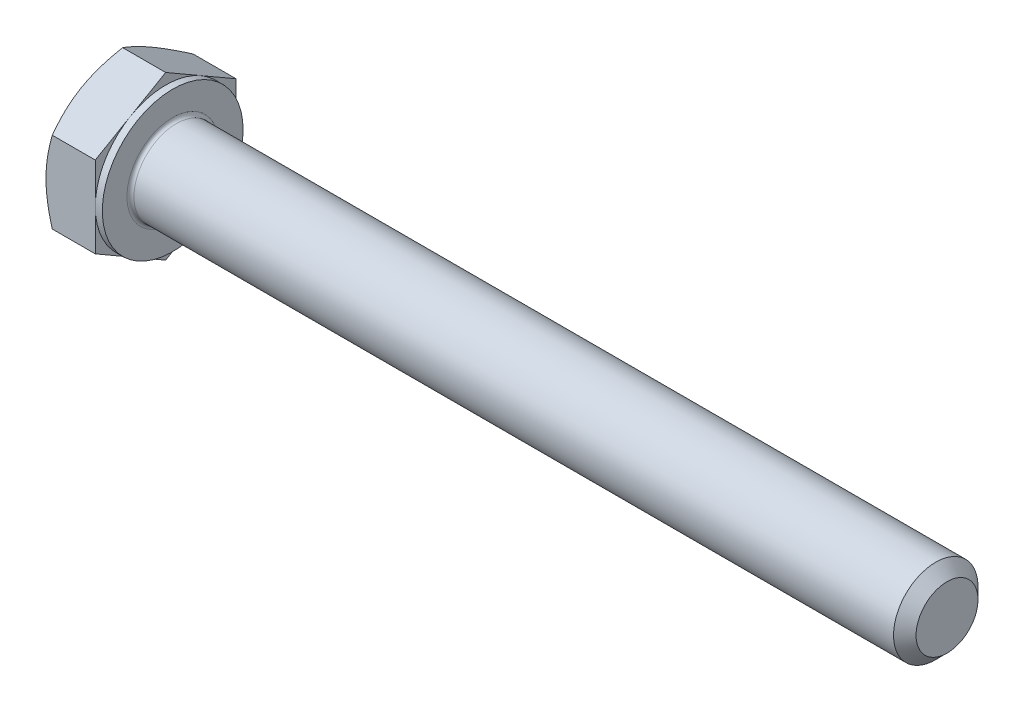
ISO-10303-21;
HEADER;
FILE_DESCRIPTION(('STEP AP214'),'2;1');
FILE_NAME('part.step','',(''),(''),'','','');
FILE_SCHEMA(('AUTOMOTIVE_DESIGN { 1 0 10303 214 1 1 1 1 }'));
ENDSEC;
DATA;
#1=APPLICATION_CONTEXT('core data for automotive mechanical design processes');
#2=APPLICATION_PROTOCOL_DEFINITION('international standard','automotive_design',2000,#1);
#3=PRODUCT_CONTEXT('',#1,'mechanical');
#4=PRODUCT('Part','Part','',(#3));
#5=PRODUCT_RELATED_PRODUCT_CATEGORY('part','',(#4));
#6=PRODUCT_DEFINITION_FORMATION('','',#4);
#7=PRODUCT_DEFINITION_CONTEXT('part definition',#1,'design');
#8=PRODUCT_DEFINITION('design','',#6,#7);
#9=PRODUCT_DEFINITION_SHAPE('','',#8);
#10=(LENGTH_UNIT() NAMED_UNIT(*) SI_UNIT(.MILLI.,.METRE.));
#11=(NAMED_UNIT(*) PLANE_ANGLE_UNIT() SI_UNIT($,.RADIAN.));
#12=(NAMED_UNIT(*) SI_UNIT($,.STERADIAN.) SOLID_ANGLE_UNIT());
#13=UNCERTAINTY_MEASURE_WITH_UNIT(LENGTH_MEASURE(1.E-05),#10,'distance_accuracy_value','');
#14=(GEOMETRIC_REPRESENTATION_CONTEXT(3) GLOBAL_UNCERTAINTY_ASSIGNED_CONTEXT((#13)) GLOBAL_UNIT_ASSIGNED_CONTEXT((#10,
#11,#12)) REPRESENTATION_CONTEXT('',''));
#15=CARTESIAN_POINT('',(0.,0.,0.));
#16=DIRECTION('',(0.,0.,1.));
#17=DIRECTION('',(1.,0.,0.));
#18=AXIS2_PLACEMENT_3D('',#15,#16,#17);
#19=CARTESIAN_POINT('',(4.,2.88675134594813,-5.));
#20=DIRECTION('',(0.,-0.866025403784438,0.500000000000001));
#21=DIRECTION('',(0.,-0.500000000000001,-0.866025403784438));
#22=AXIS2_PLACEMENT_3D('',#19,#20,#21);
#23=PLANE('',#22);
#24=DIRECTION('',(0.,0.500000000000001,0.866025403784438));
#25=VECTOR('',#24,1.);
#26=CARTESIAN_POINT('',(3.5,2.88675134594813,-5.));
#27=LINE('',#26,#25);
#28=CARTESIAN_POINT('',(3.5,2.88675134594813,-5.));
#29=VERTEX_POINT('',#28);
#30=CARTESIAN_POINT('',(3.5,4.33012701892219,-2.5));
#31=VERTEX_POINT('',#30);
#32=EDGE_CURVE('E174',#29,#31,#27,.T.);
#33=ORIENTED_EDGE('',*,*,#32,.F.);
#34=DIRECTION('',(-1.,0.,0.));
#35=VECTOR('',#34,1.);
#36=CARTESIAN_POINT('',(4.,2.88675134594813,-5.));
#37=LINE('',#36,#35);
#38=CARTESIAN_POINT('',(0.446581987385201,2.88675134594813,-5.));
#39=VERTEX_POINT('',#38);
#40=EDGE_CURVE('E302',#29,#39,#37,.T.);
#41=ORIENTED_EDGE('',*,*,#40,.T.);
#42=CARTESIAN_POINT('',(0.44664865605183,5.7736181619501,0.0002));
#43=CARTESIAN_POINT('',(0.373386567637636,5.64675433465071,-0.219534594525185));
#44=CARTESIAN_POINT('',(0.306751321918093,5.5188054379059,-0.441148584459581));
#45=CARTESIAN_POINT('',(0.190438991010812,5.26069210252318,-0.888213995453514));
#46=CARTESIAN_POINT('',(0.14080304991579,5.13052307794721,-1.11367335959077));
#47=CARTESIAN_POINT('',(0.0635510254186987,4.87177839004641,-1.56183230522351));
#48=CARTESIAN_POINT('',(0.0354203782834902,4.74324302208387,-1.78446209310419));
#49=CARTESIAN_POINT('',(0.0101949219536852,4.54998783160116,-2.11918990184664));
#50=CARTESIAN_POINT('',(0.00461345976948451,4.48552534905128,-2.23084219680506));
#51=CARTESIAN_POINT('',(-0.000797783248529426,4.35654081066911,-2.4542499706738));
#52=CARTESIAN_POINT('',(-0.000627741741796329,4.2920187567385,-2.56600544629031));
#53=CARTESIAN_POINT('',(0.00775363179203665,4.11524635305244,-2.87218423085064));
#54=CARTESIAN_POINT('',(0.0218297718972515,4.00305457769146,-3.06650608596721));
#55=CARTESIAN_POINT('',(0.0664652571094307,3.77941563226457,-3.45386010199771));
#56=CARTESIAN_POINT('',(0.0970398601475079,3.66796924828418,-3.64689090137157));
#57=CARTESIAN_POINT('',(0.173468493621163,3.44387972423144,-4.03502534247485));
#58=CARTESIAN_POINT('',(0.219646378878679,3.3312648659868,-4.23007999864174));
#59=CARTESIAN_POINT('',(0.324451794491933,3.1077146415794,-4.61728034535877));
#60=CARTESIAN_POINT('',(0.383054703437373,2.99677641204847,-4.80943099540809));
#61=CARTESIAN_POINT('',(0.446648656051827,2.88663587589429,-5.0002));
#62=B_SPLINE_CURVE_WITH_KNOTS('',3,(#42,#43,#44,#45,#46,#47,#48,#49,#50,#51,#52,#53,#54,#55,#56,
#57,#58,#59,#60,#61),.UNSPECIFIED.,.F.,.F.,(4,2,2,2,2,2,2,2,2,4),(0.,0.792555841363091,
1.58701660053334,2.36181537487281,2.74884076077325,3.13585419177295,3.80962362599679,
4.48401723901189,5.17336882348929,5.86136694793725),.UNSPECIFIED.);
#63=CARTESIAN_POINT('',(0.,4.33012701892219,-2.5));
#64=VERTEX_POINT('',#63);
#65=EDGE_CURVE('E229',#64,#39,#62,.T.);
#66=ORIENTED_EDGE('',*,*,#65,.F.);
#67=CARTESIAN_POINT('',(0.446581987385204,5.77350269189626,0.));
#68=VERTEX_POINT('',#67);
#69=EDGE_CURVE('E65',#68,#64,#62,.T.);
#70=ORIENTED_EDGE('',*,*,#69,.F.);
#71=DIRECTION('',(-1.,0.,0.));
#72=VECTOR('',#71,1.);
#73=CARTESIAN_POINT('',(4.,5.77350269189626,0.));
#74=LINE('',#73,#72);
#75=CARTESIAN_POINT('',(3.5,5.77350269189626,0.));
#76=VERTEX_POINT('',#75);
#77=EDGE_CURVE('E294',#76,#68,#74,.T.);
#78=ORIENTED_EDGE('',*,*,#77,.F.);
#79=EDGE_CURVE('E172',#31,#76,#27,.T.);
#80=ORIENTED_EDGE('',*,*,#79,.F.);
#81=EDGE_LOOP('',(#33,#41,#66,#70,#78,#80));
#82=FACE_BOUND('',#81,.T.);
#83=ADVANCED_FACE('F42',(#82),#23,.F.);
#84=CARTESIAN_POINT('',(4.,5.77350269189626,0.));
#85=DIRECTION('',(0.,-0.866025403784438,-0.500000000000001));
#86=DIRECTION('',(0.,0.500000000000001,-0.866025403784438));
#87=AXIS2_PLACEMENT_3D('',#84,#85,#86);
#88=PLANE('',#87);
#89=DIRECTION('',(0.,-0.500000000000001,0.866025403784438));
#90=VECTOR('',#89,1.);
#91=CARTESIAN_POINT('',(3.5,5.77350269189626,0.));
#92=LINE('',#91,#90);
#93=CARTESIAN_POINT('',(3.5,4.33012701892219,2.5));
#94=VERTEX_POINT('',#93);
#95=EDGE_CURVE('E171',#76,#94,#92,.T.);
#96=ORIENTED_EDGE('',*,*,#95,.F.);
#97=ORIENTED_EDGE('',*,*,#77,.T.);
#98=CARTESIAN_POINT('',(0.446648656051827,2.88663587589429,5.0002));
#99=CARTESIAN_POINT('',(0.373386567637633,3.01349970319368,4.78046540547481));
#100=CARTESIAN_POINT('',(0.30675132191809,3.14144859993849,4.55885141554042));
#101=CARTESIAN_POINT('',(0.19043899101081,3.39956193532121,4.11178600454649));
#102=CARTESIAN_POINT('',(0.140803049915788,3.52973095989717,3.88632664040923));
#103=CARTESIAN_POINT('',(0.0635510254186973,3.78847564779797,3.43816769477649));
#104=CARTESIAN_POINT('',(0.0354203782834888,3.91701101576052,3.21553790689581));
#105=CARTESIAN_POINT('',(0.0101949219536842,4.11026620624322,2.88081009815336));
#106=CARTESIAN_POINT('',(0.00461345976948371,4.17472868879311,2.76915780319494));
#107=CARTESIAN_POINT('',(-0.000797783248529873,4.30371322717528,2.5457500293262));
#108=CARTESIAN_POINT('',(-0.000627741741796623,4.36823528110589,2.43399455370969));
#109=CARTESIAN_POINT('',(0.00775363179203684,4.54500768479194,2.12781576914936));
#110=CARTESIAN_POINT('',(0.0218297718972522,4.65719946015292,1.93349391403279));
#111=CARTESIAN_POINT('',(0.0664652571094319,4.88083840557981,1.5461398980023));
#112=CARTESIAN_POINT('',(0.0970398601475093,4.9922847895602,1.35310909862843));
#113=CARTESIAN_POINT('',(0.173468493621165,5.21637431361295,0.964974657525146));
#114=CARTESIAN_POINT('',(0.219646378878682,5.32898917185759,0.769920001358265));
#115=CARTESIAN_POINT('',(0.324451794491936,5.55253939626498,0.382719654641232));
#116=CARTESIAN_POINT('',(0.383054703437376,5.66347762579592,0.190569004591913));
#117=CARTESIAN_POINT('',(0.44664865605183,5.7736181619501,-0.000200000000000133));
#118=B_SPLINE_CURVE_WITH_KNOTS('',3,(#98,#99,#100,#101,#102,#103,#104,#105,#106,#107,#108,#109,
#110,#111,#112,#113,#114,#115,#116,#117),.UNSPECIFIED.,.F.,.F.,(4,2,2,2,2,2,2,2,2,4),(0.,
0.79255584136309,1.58701660053333,2.3618153748728,2.74884076077325,3.13585419177295,
3.80962362599679,4.48401723901189,5.17336882348929,5.86136694793726),.UNSPECIFIED.);
#119=CARTESIAN_POINT('',(0.,4.33012701892219,2.50000000000001));
#120=VERTEX_POINT('',#119);
#121=EDGE_CURVE('E226',#120,#68,#118,.T.);
#122=ORIENTED_EDGE('',*,*,#121,.F.);
#123=CARTESIAN_POINT('',(0.4465819873852,2.88675134594813,5.));
#124=VERTEX_POINT('',#123);
#125=EDGE_CURVE('E240',#124,#120,#118,.T.);
#126=ORIENTED_EDGE('',*,*,#125,.F.);
#127=DIRECTION('',(-1.,0.,0.));
#128=VECTOR('',#127,1.);
#129=CARTESIAN_POINT('',(4.,2.88675134594813,5.));
#130=LINE('',#129,#128);
#131=CARTESIAN_POINT('',(3.5,2.88675134594813,5.));
#132=VERTEX_POINT('',#131);
#133=EDGE_CURVE('E296',#132,#124,#130,.T.);
#134=ORIENTED_EDGE('',*,*,#133,.F.);
#135=EDGE_CURVE('E139',#94,#132,#92,.T.);
#136=ORIENTED_EDGE('',*,*,#135,.F.);
#137=EDGE_LOOP('',(#96,#97,#122,#126,#134,#136));
#138=FACE_BOUND('',#137,.T.);
#139=ADVANCED_FACE('F247',(#138),#88,.F.);
#140=CARTESIAN_POINT('',(4.,2.88675134594813,5.));
#141=DIRECTION('',(0.,0.,-1.));
#142=DIRECTION('',(-1.,0.,0.));
#143=AXIS2_PLACEMENT_3D('',#140,#141,#142);
#144=PLANE('',#143);
#145=DIRECTION('',(0.,-1.,0.));
#146=VECTOR('',#145,1.);
#147=CARTESIAN_POINT('',(3.5,2.88675134594813,5.));
#148=LINE('',#147,#146);
#149=CARTESIAN_POINT('',(3.5,0.,5.));
#150=VERTEX_POINT('',#149);
#151=EDGE_CURVE('E133',#132,#150,#148,.T.);
#152=ORIENTED_EDGE('',*,*,#151,.F.);
#153=ORIENTED_EDGE('',*,*,#133,.T.);
#154=CARTESIAN_POINT('',(2.47533544689296,-7.8266164031389,5.));
#155=CARTESIAN_POINT('',(2.36879683507773,-7.60758613024922,5.));
#156=CARTESIAN_POINT('',(2.26325911833056,-7.38806071364411,5.));
#157=CARTESIAN_POINT('',(2.05474707865951,-6.94775649535434,5.));
#158=CARTESIAN_POINT('',(1.95177314617003,-6.72697750897689,5.));
#159=CARTESIAN_POINT('',(1.74844778545275,-6.28280027125598,5.));
#160=CARTESIAN_POINT('',(1.64811306490869,-6.05939434592714,5.));
#161=CARTESIAN_POINT('',(1.45145486004312,-5.61083043832921,5.));
#162=CARTESIAN_POINT('',(1.35513119080617,-5.38567253739806,5.));
#163=CARTESIAN_POINT('',(1.16445037605961,-4.92576614780203,5.));
#164=CARTESIAN_POINT('',(1.07026351405996,-4.69094667859485,5.));
#165=CARTESIAN_POINT('',(0.88884438735084,-4.21858752735363,5.));
#166=CARTESIAN_POINT('',(0.801612892640662,-3.98104754746318,5.));
#167=CARTESIAN_POINT('',(0.636341071883241,-3.50329086404364,5.));
#168=CARTESIAN_POINT('',(0.558282765149712,-3.26308044250487,5.));
#169=CARTESIAN_POINT('',(0.413813856737666,-2.77921467819532,5.));
#170=CARTESIAN_POINT('',(0.347399663631976,-2.53556042276,5.));
#171=CARTESIAN_POINT('',(0.229707450535052,-2.04600448312504,5.));
#172=CARTESIAN_POINT('',(0.178346573442479,-1.80012308686184,5.));
#173=CARTESIAN_POINT('',(0.0936230804935155,-1.30522837494366,5.));
#174=CARTESIAN_POINT('',(0.0602585789244923,-1.05621539022478,5.));
#175=CARTESIAN_POINT('',(0.014622993380484,-0.559584253783073,5.));
#176=CARTESIAN_POINT('',(0.00207498506584076,-0.31199219296768,5.));
#177=CARTESIAN_POINT('',(-0.00159747165030538,0.183375584056734,5.));
#178=CARTESIAN_POINT('',(0.0072784944808621,0.431151303726636,5.));
#179=CARTESIAN_POINT('',(0.0397265053205833,0.849622860758222,5.));
#180=CARTESIAN_POINT('',(0.0579847912618783,1.02075746544156,5.));
#181=CARTESIAN_POINT('',(0.103624049996721,1.36181398757519,5.));
#182=CARTESIAN_POINT('',(0.131006199082923,1.5317357457727,5.));
#183=CARTESIAN_POINT('',(0.225403333816321,2.03942834541586,5.));
#184=CARTESIAN_POINT('',(0.304653621104035,2.37495177168563,5.));
#185=CARTESIAN_POINT('',(0.442611792168637,2.87686006020151,5.));
#186=CARTESIAN_POINT('',(0.492453035928114,3.04583048582564,5.));
#187=CARTESIAN_POINT('',(0.597441969480138,3.38213061038658,5.));
#188=CARTESIAN_POINT('',(0.652589698776802,3.54946029709869,5.));
#189=CARTESIAN_POINT('',(0.767295730006394,3.88253122341816,5.));
#190=CARTESIAN_POINT('',(0.826852713137812,4.04827292137364,5.));
#191=CARTESIAN_POINT('',(0.949663499110049,4.37837269604183,5.));
#192=CARTESIAN_POINT('',(1.01291722636637,4.54273080096525,5.));
#193=CARTESIAN_POINT('',(1.18384085306905,4.97467594039769,5.));
#194=CARTESIAN_POINT('',(1.29410564783453,5.24123504256648,5.));
#195=CARTESIAN_POINT('',(1.52085041203992,5.77170603526334,5.));
#196=CARTESIAN_POINT('',(1.63733099805396,6.03561766007928,5.));
#197=CARTESIAN_POINT('',(1.87507624393348,6.56138078778337,5.));
#198=CARTESIAN_POINT('',(1.99634255328238,6.82323154239329,5.));
#199=CARTESIAN_POINT('',(2.24254703861692,7.34518395602015,5.));
#200=CARTESIAN_POINT('',(2.36748508200602,7.60528567778374,5.));
#201=CARTESIAN_POINT('',(2.62044102887898,8.12446478659922,5.));
#202=CARTESIAN_POINT('',(2.74846325062126,8.38354006552433,5.));
#203=CARTESIAN_POINT('',(3.00682668967549,8.9005329112754,5.));
#204=CARTESIAN_POINT('',(3.13716793074432,9.15845046620729,5.));
#205=CARTESIAN_POINT('',(3.53092424591316,9.93067662274979,5.));
#206=CARTESIAN_POINT('',(3.79712405172275,10.4435647238032,5.));
#207=CARTESIAN_POINT('',(4.3072404688117,11.4147548711532,5.));
#208=CARTESIAN_POINT('',(4.55067498762245,11.873311348306,5.));
#209=CARTESIAN_POINT('',(5.04052915785298,12.7888590468283,5.));
#210=CARTESIAN_POINT('',(5.28694897482743,13.2458501795696,5.));
#211=CARTESIAN_POINT('',(5.7812250534644,14.1571829390174,5.));
#212=CARTESIAN_POINT('',(6.02907430461245,14.6115283739736,5.));
#213=CARTESIAN_POINT('',(6.5264818551985,15.5192398746589,5.));
#214=CARTESIAN_POINT('',(6.77604002809907,15.9726060096992,5.));
#215=CARTESIAN_POINT('',(7.02622264559118,16.4256251044156,5.));
#216=B_SPLINE_CURVE_WITH_KNOTS('',3,(#154,#155,#156,#157,#158,#159,#160,#161,#162,#163,#164,
#165,#166,#167,#168,#169,#170,#171,#172,#173,#174,#175,#176,#177,#178,#179,#180,#181,#182,#183,
#184,#185,#186,#187,#188,#189,#190,#191,#192,#193,#194,#195,#196,#197,#198,#199,#200,#201,#202,
#203,#204,#205,#206,#207,#208,#209,#210,#211,#212,#213,#214,#215),.UNSPECIFIED.,.F.,.F.,(4,2,2,
2,2,2,2,2,2,2,2,2,2,2,2,2,2,2,2,2,2,2,2,2,2,2,2,2,2,2,4),(0.,0.730708682143099,1.46152797033751,
2.19620403652928,2.930846195478,3.68977491658213,4.44878753915767,5.20628666210828,
5.9635517348485,6.71656679485872,7.46950293642268,8.212339912373,8.95519126159774,
9.47125991232469,9.98739512288342,11.0201893937443,11.5486465414698,12.0771076235976,
12.6054112774226,13.1337041332035,13.9989833719716,14.8643486020619,15.7300147459346,
16.5956496665091,17.4625765068272,18.3295122333794,20.0630293163822,21.6205191219182,
23.1780956996636,24.7307447704824,26.2832800921359),.UNSPECIFIED.);
#217=CARTESIAN_POINT('',(0.,0.,5.));
#218=VERTEX_POINT('',#217);
#219=EDGE_CURVE('E241',#218,#124,#216,.T.);
#220=ORIENTED_EDGE('',*,*,#219,.F.);
#221=CARTESIAN_POINT('',(0.446581987385202,-2.88675134594813,5.));
#222=VERTEX_POINT('',#221);
#223=EDGE_CURVE('E303',#222,#218,#216,.T.);
#224=ORIENTED_EDGE('',*,*,#223,.F.);
#225=DIRECTION('',(-1.,0.,0.));
#226=VECTOR('',#225,1.);
#227=CARTESIAN_POINT('',(4.,-2.88675134594813,5.));
#228=LINE('',#227,#226);
#229=CARTESIAN_POINT('',(3.5,-2.88675134594813,5.));
#230=VERTEX_POINT('',#229);
#231=EDGE_CURVE('E165',#230,#222,#228,.T.);
#232=ORIENTED_EDGE('',*,*,#231,.F.);
#233=EDGE_CURVE('E143',#150,#230,#148,.T.);
#234=ORIENTED_EDGE('',*,*,#233,.F.);
#235=EDGE_LOOP('',(#152,#153,#220,#224,#232,#234));
#236=FACE_BOUND('',#235,.T.);
#237=ADVANCED_FACE('F163',(#236),#144,.F.);
#238=CARTESIAN_POINT('',(4.,-5.77350269189627,0.));
#239=DIRECTION('',(0.,0.866025403784438,-0.500000000000001));
#240=DIRECTION('',(0.,0.500000000000001,0.866025403784438));
#241=AXIS2_PLACEMENT_3D('',#238,#239,#240);
#242=PLANE('',#241);
#243=DIRECTION('',(0.,-0.500000000000001,-0.866025403784438));
#244=VECTOR('',#243,1.);
#245=CARTESIAN_POINT('',(3.5,-5.77350269189627,0.));
#246=LINE('',#245,#244);
#247=CARTESIAN_POINT('',(3.5,-4.33012701892219,2.50000000000001));
#248=VERTEX_POINT('',#247);
#249=EDGE_CURVE('E150',#230,#248,#246,.T.);
#250=ORIENTED_EDGE('',*,*,#249,.F.);
#251=ORIENTED_EDGE('',*,*,#231,.T.);
#252=CARTESIAN_POINT('',(0.446648656051834,-5.77361816195011,-0.000200000000000089));
#253=CARTESIAN_POINT('',(0.37338656763764,-5.64675433465072,0.219534594525185));
#254=CARTESIAN_POINT('',(0.306751321918097,-5.51880543790591,0.441148584459581));
#255=CARTESIAN_POINT('',(0.190438991010815,-5.26069210252319,0.888213995453514));
#256=CARTESIAN_POINT('',(0.140803049915793,-5.13052307794722,1.11367335959078));
#257=CARTESIAN_POINT('',(0.0635510254187016,-4.87177839004642,1.56183230522351));
#258=CARTESIAN_POINT('',(0.0354203782834927,-4.74324302208387,1.78446209310419));
#259=CARTESIAN_POINT('',(0.0101949219536879,-4.54998783160117,2.11918990184664));
#260=CARTESIAN_POINT('',(0.00461345976948741,-4.48552534905128,2.23084219680506));
#261=CARTESIAN_POINT('',(-0.00079778324852632,-4.35654081066911,2.4542499706738));
#262=CARTESIAN_POINT('',(-0.000627741741793222,-4.2920187567385,2.56600544629032));
#263=CARTESIAN_POINT('',(0.00775363179203982,-4.11524635305245,2.87218423085064));
#264=CARTESIAN_POINT('',(0.0218297718972548,-4.00305457769146,3.06650608596722));
#265=CARTESIAN_POINT('',(0.0664652571094336,-3.77941563226458,3.45386010199771));
#266=CARTESIAN_POINT('',(0.0970398601475104,-3.66796924828419,3.64689090137157));
#267=CARTESIAN_POINT('',(0.173468493621165,-3.44387972423144,4.03502534247485));
#268=CARTESIAN_POINT('',(0.219646378878682,-3.3312648659868,4.23007999864174));
#269=CARTESIAN_POINT('',(0.324451794491935,-3.10771464157941,4.61728034535877));
#270=CARTESIAN_POINT('',(0.383054703437375,-2.99677641204847,4.80943099540809));
#271=CARTESIAN_POINT('',(0.446648656051828,-2.88663587589429,5.0002));
#272=B_SPLINE_CURVE_WITH_KNOTS('',3,(#252,#253,#254,#255,#256,#257,#258,#259,#260,#261,#262,
#263,#264,#265,#266,#267,#268,#269,#270,#271),.UNSPECIFIED.,.F.,.F.,(4,2,2,2,2,2,2,2,2,4),(0.,
0.792555841363092,1.58701660053334,2.36181537487281,2.74884076077326,3.13585419177295,
3.8096236259968,4.4840172390119,5.17336882348929,5.86136694793725),.UNSPECIFIED.);
#273=CARTESIAN_POINT('',(0.,-4.33012701892219,2.50000000000001));
#274=VERTEX_POINT('',#273);
#275=EDGE_CURVE('E228',#274,#222,#272,.T.);
#276=ORIENTED_EDGE('',*,*,#275,.F.);
#277=CARTESIAN_POINT('',(0.446581987385207,-5.77350269189627,0.));
#278=VERTEX_POINT('',#277);
#279=EDGE_CURVE('E220',#278,#274,#272,.T.);
#280=ORIENTED_EDGE('',*,*,#279,.F.);
#281=DIRECTION('',(-1.,0.,0.));
#282=VECTOR('',#281,1.);
#283=CARTESIAN_POINT('',(4.,-5.77350269189627,0.));
#284=LINE('',#283,#282);
#285=CARTESIAN_POINT('',(3.5,-5.77350269189627,0.));
#286=VERTEX_POINT('',#285);
#287=EDGE_CURVE('E299',#286,#278,#284,.T.);
#288=ORIENTED_EDGE('',*,*,#287,.F.);
#289=EDGE_CURVE('E166',#248,#286,#246,.T.);
#290=ORIENTED_EDGE('',*,*,#289,.F.);
#291=EDGE_LOOP('',(#250,#251,#276,#280,#288,#290));
#292=FACE_BOUND('',#291,.T.);
#293=ADVANCED_FACE('F211',(#292),#242,.F.);
#294=CARTESIAN_POINT('',(4.,-2.88675134594813,-5.));
#295=DIRECTION('',(0.,0.866025403784438,0.5));
#296=DIRECTION('',(0.,-0.5,0.866025403784438));
#297=AXIS2_PLACEMENT_3D('',#294,#295,#296);
#298=PLANE('',#297);
#299=DIRECTION('',(0.,0.5,-0.866025403784438));
#300=VECTOR('',#299,1.);
#301=CARTESIAN_POINT('',(3.5,-2.88675134594813,-5.));
#302=LINE('',#301,#300);
#303=CARTESIAN_POINT('',(3.5,-4.33012701892219,-2.5));
#304=VERTEX_POINT('',#303);
#305=EDGE_CURVE('E349',#286,#304,#302,.T.);
#306=ORIENTED_EDGE('',*,*,#305,.F.);
#307=ORIENTED_EDGE('',*,*,#287,.T.);
#308=CARTESIAN_POINT('',(0.44664865605183,-2.8866358758943,-5.0002));
#309=CARTESIAN_POINT('',(0.373386567637636,-3.01349970319369,-4.78046540547482));
#310=CARTESIAN_POINT('',(0.306751321918094,-3.1414485999385,-4.55885141554042));
#311=CARTESIAN_POINT('',(0.190438991010813,-3.39956193532121,-4.11178600454649));
#312=CARTESIAN_POINT('',(0.140803049915792,-3.52973095989718,-3.88632664040923));
#313=CARTESIAN_POINT('',(0.0635510254187009,-3.78847564779798,-3.43816769477649));
#314=CARTESIAN_POINT('',(0.0354203782834924,-3.91701101576052,-3.21553790689581));
#315=CARTESIAN_POINT('',(0.0101949219536882,-4.11026620624323,-2.88081009815336));
#316=CARTESIAN_POINT('',(0.00461345976948794,-4.17472868879311,-2.76915780319494));
#317=CARTESIAN_POINT('',(-0.000797783248525594,-4.30371322717528,-2.5457500293262));
#318=CARTESIAN_POINT('',(-0.000627741741792501,-4.3682352811059,-2.43399455370969));
#319=CARTESIAN_POINT('',(0.00775363179204097,-4.54500768479195,-2.12781576914936));
#320=CARTESIAN_POINT('',(0.0218297718972568,-4.65719946015293,-1.93349391403279));
#321=CARTESIAN_POINT('',(0.0664652571094364,-4.88083840557982,-1.54613989800229));
#322=CARTESIAN_POINT('',(0.0970398601475133,-4.99228478956021,-1.35310909862843));
#323=CARTESIAN_POINT('',(0.173468493621169,-5.21637431361296,-0.964974657525146));
#324=CARTESIAN_POINT('',(0.219646378878685,-5.3289891718576,-0.769920001358264));
#325=CARTESIAN_POINT('',(0.32445179449194,-5.55253939626499,-0.382719654641232));
#326=CARTESIAN_POINT('',(0.38305470343738,-5.66347762579593,-0.190569004591914));
#327=CARTESIAN_POINT('',(0.446648656051834,-5.77361816195011,0.0001999999999997));
#328=B_SPLINE_CURVE_WITH_KNOTS('',3,(#308,#309,#310,#311,#312,#313,#314,#315,#316,#317,#318,
#319,#320,#321,#322,#323,#324,#325,#326,#327),.UNSPECIFIED.,.F.,.F.,(4,2,2,2,2,2,2,2,2,4),(0.,
0.792555841363092,1.58701660053334,2.36181537487281,2.74884076077326,3.13585419177295,
3.80962362599679,4.48401723901189,5.17336882348929,5.86136694793725),.UNSPECIFIED.);
#329=CARTESIAN_POINT('',(0.,-4.33012701892219,-2.5));
#330=VERTEX_POINT('',#329);
#331=EDGE_CURVE('E227',#330,#278,#328,.T.);
#332=ORIENTED_EDGE('',*,*,#331,.F.);
#333=CARTESIAN_POINT('',(0.446581987384949,-2.88675134594852,-5.));
#334=VERTEX_POINT('',#333);
#335=EDGE_CURVE('E188',#334,#330,#328,.T.);
#336=ORIENTED_EDGE('',*,*,#335,.F.);
#337=DIRECTION('',(-1.,0.,0.));
#338=VECTOR('',#337,1.);
#339=CARTESIAN_POINT('',(4.,-2.88675134594813,-5.));
#340=LINE('',#339,#338);
#341=CARTESIAN_POINT('',(3.5,-2.88675134594813,-5.));
#342=VERTEX_POINT('',#341);
#343=EDGE_CURVE('E301',#342,#334,#340,.T.);
#344=ORIENTED_EDGE('',*,*,#343,.F.);
#345=EDGE_CURVE('E161',#304,#342,#302,.T.);
#346=ORIENTED_EDGE('',*,*,#345,.F.);
#347=EDGE_LOOP('',(#306,#307,#332,#336,#344,#346));
#348=FACE_BOUND('',#347,.T.);
#349=ADVANCED_FACE('F204',(#348),#298,.F.);
#350=CARTESIAN_POINT('',(4.,2.88675134594813,-5.));
#351=DIRECTION('',(0.,0.,1.));
#352=DIRECTION('',(0.,-1.,0.));
#353=AXIS2_PLACEMENT_3D('',#350,#351,#352);
#354=PLANE('',#353);
#355=DIRECTION('',(0.,1.,0.));
#356=VECTOR('',#355,1.);
#357=CARTESIAN_POINT('',(3.5,2.88675134594813,-5.));
#358=LINE('',#357,#356);
#359=CARTESIAN_POINT('',(3.5,0.,-5.));
#360=VERTEX_POINT('',#359);
#361=EDGE_CURVE('E273',#342,#360,#358,.T.);
#362=ORIENTED_EDGE('',*,*,#361,.F.);
#363=ORIENTED_EDGE('',*,*,#343,.T.);
#364=CARTESIAN_POINT('',(2.47533544773018,-7.82661640485967,-5.));
#365=CARTESIAN_POINT('',(2.36879683588,-7.60758613191209,-5.));
#366=CARTESIAN_POINT('',(2.2632591190979,-7.38806071524903,-5.));
#367=CARTESIAN_POINT('',(2.05474707935716,-6.9477564968432,-5.));
#368=CARTESIAN_POINT('',(1.95177314683291,-6.72697751040763,-5.));
#369=CARTESIAN_POINT('',(1.74844778604609,-6.28280027256958,-5.));
#370=CARTESIAN_POINT('',(1.64811306546725,-6.05939434718172,-5.));
#371=CARTESIAN_POINT('',(1.4514548605327,-5.61083043946536,-5.));
#372=CARTESIAN_POINT('',(1.35513119126155,-5.38567253847479,-5.));
#373=CARTESIAN_POINT('',(1.16445037644562,-4.92576614875538,-5.));
#374=CARTESIAN_POINT('',(1.07026351441089,-4.69094667948419,-5.));
#375=CARTESIAN_POINT('',(0.888844387633474,-4.21858752811391,-5.));
#376=CARTESIAN_POINT('',(0.801612892890087,-3.98104754815841,-5.));
#377=CARTESIAN_POINT('',(0.636341072069425,-3.50329086460758,-5.));
#378=CARTESIAN_POINT('',(0.558282765305855,-3.26308044300257,-5.));
#379=CARTESIAN_POINT('',(0.41381385683863,-2.77921467855872,-5.));
#380=CARTESIAN_POINT('',(0.347399663707799,-2.53556042305535,-5.));
#381=CARTESIAN_POINT('',(0.229707450560149,-2.04600448324933,-5.));
#382=CARTESIAN_POINT('',(0.178346573443938,-1.80012308688265,-5.));
#383=CARTESIAN_POINT('',(0.0936230804633186,-1.305228374755,-5.));
#384=CARTESIAN_POINT('',(0.060258578886266,-1.05621538993014,-5.));
#385=CARTESIAN_POINT('',(0.0146229933450855,-0.559584253278235,-5.));
#386=CARTESIAN_POINT('',(0.00207498504095128,-0.311992192358638,-5.));
#387=CARTESIAN_POINT('',(-0.00159747163599431,0.183375584872586,-5.));
#388=CARTESIAN_POINT('',(0.00727849452386967,0.431151304645096,-5.));
#389=CARTESIAN_POINT('',(0.0397265054214774,0.849622861805588,-5.));
#390=CARTESIAN_POINT('',(0.0579847913857288,1.02075746651638,-5.));
#391=CARTESIAN_POINT('',(0.103624050167705,1.3618139887037,-5.));
#392=CARTESIAN_POINT('',(0.131006199278085,1.53173574692745,-5.));
#393=CARTESIAN_POINT('',(0.225403334084525,2.03942834664787,-5.));
#394=CARTESIAN_POINT('',(0.304653621421581,2.37495177296713,-5.));
#395=CARTESIAN_POINT('',(0.442611792558999,2.87686006155704,-5.));
#396=CARTESIAN_POINT('',(0.492453036342916,3.04583048720638,-5.));
#397=CARTESIAN_POINT('',(0.597441969943076,3.38213061181744,-5.));
#398=CARTESIAN_POINT('',(0.652589699263438,3.54946029855447,-5.));
#399=CARTESIAN_POINT('',(0.767295730539578,3.88253122492361,-5.));
#400=CARTESIAN_POINT('',(0.826852713693846,4.04827292290383,-5.));
#401=CARTESIAN_POINT('',(0.949663499710994,4.3783726976215,-5.));
#402=CARTESIAN_POINT('',(1.01291722698937,4.54273080256967,-5.));
#403=CARTESIAN_POINT('',(1.18384085372923,4.97467594201676,-5.));
#404=CARTESIAN_POINT('',(1.29410564850765,5.24123504417614,-5.));
#405=CARTESIAN_POINT('',(1.5208504127353,5.77170603685537,-5.));
#406=CARTESIAN_POINT('',(1.63733099875865,6.03561766166309,-5.));
#407=CARTESIAN_POINT('',(1.87507624465413,6.56138078935162,-5.));
#408=CARTESIAN_POINT('',(1.99634255400967,6.82323154395419,-5.));
#409=CARTESIAN_POINT('',(2.24254703935561,7.34518395756715,-5.));
#410=CARTESIAN_POINT('',(2.36748508274945,7.60528567932418,-5.));
#411=CARTESIAN_POINT('',(2.62044102963033,8.12446478812676,-5.));
#412=CARTESIAN_POINT('',(2.74846325137578,8.38354006704553,-5.));
#413=CARTESIAN_POINT('',(3.00682669043527,8.90053291278441,-5.));
#414=CARTESIAN_POINT('',(3.1371679315062,9.15845046771044,-5.));
#415=CARTESIAN_POINT('',(3.53092424668022,9.93067662423605,-5.));
#416=CARTESIAN_POINT('',(3.79712405249168,10.443564725279,-5.));
#417=CARTESIAN_POINT('',(4.30724046958687,11.4147548726184,-5.));
#418=CARTESIAN_POINT('',(4.55067498840223,11.8733113497711,-5.));
#419=CARTESIAN_POINT('',(5.04052915864104,12.7888590482936,-5.));
#420=CARTESIAN_POINT('',(5.28694897561916,13.2458501810351,-5.));
#421=CARTESIAN_POINT('',(5.78122505426358,14.1571829404851,-5.));
#422=CARTESIAN_POINT('',(6.02907430541544,14.6115283754434,-5.));
#423=CARTESIAN_POINT('',(6.52648185600867,15.519239876133,-5.));
#424=CARTESIAN_POINT('',(6.7760400289126,15.9726060111756,-5.));
#425=CARTESIAN_POINT('',(7.02622264640795,16.4256251058943,-5.));
#426=B_SPLINE_CURVE_WITH_KNOTS('',3,(#364,#365,#366,#367,#368,#369,#370,#371,#372,#373,#374,
#375,#376,#377,#378,#379,#380,#381,#382,#383,#384,#385,#386,#387,#388,#389,#390,#391,#392,#393,
#394,#395,#396,#397,#398,#399,#400,#401,#402,#403,#404,#405,#406,#407,#408,#409,#410,#411,#412,
#413,#414,#415,#416,#417,#418,#419,#420,#421,#422,#423,#424,#425),.UNSPECIFIED.,.F.,.F.,(4,2,2,
2,2,2,2,2,2,2,2,2,2,2,2,2,2,2,2,2,2,2,2,2,2,2,2,2,2,2,4),(0.,0.730708682345173,1.46152797074168,
2.19620403713772,2.93084619629067,3.6897749176122,4.44878754040521,5.20628666357256,
5.96355173652936,6.7165667968573,7.46950293873851,8.21233991499824,8.95519126453256,
9.47125991534871,9.98739512599665,11.0201893970363,11.5486465448551,12.0771076270762,
12.6054112809942,13.1337041368682,13.9989833756252,14.8643486057043,15.7300147495654,
16.5956496701284,17.4625765104336,18.329512236973,20.0630293199505,21.6205191254926,
23.178095703244,24.7307447740735,26.2832800957379),.UNSPECIFIED.);
#427=CARTESIAN_POINT('',(0.,0.,-5.));
#428=VERTEX_POINT('',#427);
#429=EDGE_CURVE('E178',#428,#334,#426,.F.);
#430=ORIENTED_EDGE('',*,*,#429,.F.);
#431=EDGE_CURVE('E187',#39,#428,#426,.F.);
#432=ORIENTED_EDGE('',*,*,#431,.F.);
#433=ORIENTED_EDGE('',*,*,#40,.F.);
#434=EDGE_CURVE('E277',#360,#29,#358,.T.);
#435=ORIENTED_EDGE('',*,*,#434,.F.);
#436=EDGE_LOOP('',(#362,#363,#430,#432,#433,#435));
#437=FACE_BOUND('',#436,.T.);
#438=ADVANCED_FACE('F199',(#437),#354,.F.);
#439=CARTESIAN_POINT('',(0.,0.,0.));
#440=DIRECTION('',(1.,0.,0.));
#441=DIRECTION('',(0.,0.,-1.));
#442=AXIS2_PLACEMENT_3D('',#439,#440,#441);
#443=CONICAL_SURFACE('',#442,5.,1.0471975511966);
#444=ORIENTED_EDGE('',*,*,#335,.T.);
#445=CARTESIAN_POINT('',(0.,0.,0.));
#446=DIRECTION('',(1.,0.,0.));
#447=DIRECTION('',(0.,0.,-1.));
#448=AXIS2_PLACEMENT_3D('',#445,#446,#447);
#449=CIRCLE('',#448,5.);
#450=EDGE_CURVE('E290',#330,#428,#449,.T.);
#451=ORIENTED_EDGE('',*,*,#450,.T.);
#452=ORIENTED_EDGE('',*,*,#429,.T.);
#453=EDGE_LOOP('',(#444,#451,#452));
#454=FACE_BOUND('',#453,.T.);
#455=ADVANCED_FACE('F203',(#454),#443,.T.);
#456=ORIENTED_EDGE('',*,*,#279,.T.);
#457=EDGE_CURVE('E293',#274,#330,#449,.T.);
#458=ORIENTED_EDGE('',*,*,#457,.T.);
#459=ORIENTED_EDGE('',*,*,#331,.T.);
#460=EDGE_LOOP('',(#456,#458,#459));
#461=FACE_BOUND('',#460,.T.);
#462=ADVANCED_FACE('F346',(#461),#443,.T.);
#463=ORIENTED_EDGE('',*,*,#223,.T.);
#464=EDGE_CURVE('E323',#218,#274,#449,.T.);
#465=ORIENTED_EDGE('',*,*,#464,.T.);
#466=ORIENTED_EDGE('',*,*,#275,.T.);
#467=EDGE_LOOP('',(#463,#465,#466));
#468=FACE_BOUND('',#467,.T.);
#469=ADVANCED_FACE('F195',(#468),#443,.T.);
#470=ORIENTED_EDGE('',*,*,#219,.T.);
#471=ORIENTED_EDGE('',*,*,#125,.T.);
#472=CARTESIAN_POINT('',(0.,0.,0.));
#473=DIRECTION('',(-1.,0.,0.));
#474=DIRECTION('',(0.,0.,1.));
#475=AXIS2_PLACEMENT_3D('',#472,#473,#474);
#476=CIRCLE('',#475,5.);
#477=EDGE_CURVE('E175',#218,#120,#476,.T.);
#478=ORIENTED_EDGE('',*,*,#477,.F.);
#479=EDGE_LOOP('',(#470,#471,#478));
#480=FACE_BOUND('',#479,.T.);
#481=ADVANCED_FACE('F317',(#480),#443,.T.);
#482=ORIENTED_EDGE('',*,*,#121,.T.);
#483=ORIENTED_EDGE('',*,*,#69,.T.);
#484=EDGE_CURVE('E288',#64,#120,#449,.T.);
#485=ORIENTED_EDGE('',*,*,#484,.T.);
#486=EDGE_LOOP('',(#482,#483,#485));
#487=FACE_BOUND('',#486,.T.);
#488=ADVANCED_FACE('F321',(#487),#443,.T.);
#489=ORIENTED_EDGE('',*,*,#65,.T.);
#490=ORIENTED_EDGE('',*,*,#431,.T.);
#491=EDGE_CURVE('E287',#428,#64,#449,.T.);
#492=ORIENTED_EDGE('',*,*,#491,.T.);
#493=EDGE_LOOP('',(#489,#490,#492));
#494=FACE_BOUND('',#493,.T.);
#495=ADVANCED_FACE('F337',(#494),#443,.T.);
#496=CARTESIAN_POINT('',(0.,5.77350269189626,0.));
#497=DIRECTION('',(1.,0.,0.));
#498=DIRECTION('',(0.,0.,-1.));
#499=AXIS2_PLACEMENT_3D('',#496,#497,#498);
#500=PLANE('',#499);
#501=ORIENTED_EDGE('',*,*,#491,.F.);
#502=ORIENTED_EDGE('',*,*,#450,.F.);
#503=ORIENTED_EDGE('',*,*,#457,.F.);
#504=ORIENTED_EDGE('',*,*,#464,.F.);
#505=ORIENTED_EDGE('',*,*,#477,.T.);
#506=ORIENTED_EDGE('',*,*,#484,.F.);
#507=EDGE_LOOP('',(#501,#502,#503,#504,#505,#506));
#508=FACE_BOUND('',#507,.T.);
#509=ADVANCED_FACE('F206',(#508),#500,.F.);
#510=CARTESIAN_POINT('',(3.5,5.,0.));
#511=DIRECTION('',(1.,0.,0.));
#512=DIRECTION('',(0.,0.,-1.));
#513=AXIS2_PLACEMENT_3D('',#510,#511,#512);
#514=PLANE('',#513);
#515=ORIENTED_EDGE('',*,*,#32,.T.);
#516=CARTESIAN_POINT('',(3.5,0.,0.));
#517=DIRECTION('',(-1.,0.,0.));
#518=DIRECTION('',(0.,0.,1.));
#519=AXIS2_PLACEMENT_3D('',#516,#517,#518);
#520=CIRCLE('',#519,5.);
#521=EDGE_CURVE('E57',#31,#360,#520,.T.);
#522=ORIENTED_EDGE('',*,*,#521,.T.);
#523=ORIENTED_EDGE('',*,*,#434,.T.);
#524=EDGE_LOOP('',(#515,#522,#523));
#525=FACE_BOUND('',#524,.T.);
#526=ADVANCED_FACE('F355',(#525),#514,.T.);
#527=ORIENTED_EDGE('',*,*,#79,.T.);
#528=ORIENTED_EDGE('',*,*,#95,.T.);
#529=EDGE_CURVE('E160',#94,#31,#520,.T.);
#530=ORIENTED_EDGE('',*,*,#529,.T.);
#531=EDGE_LOOP('',(#527,#528,#530));
#532=FACE_BOUND('',#531,.T.);
#533=ADVANCED_FACE('F357',(#532),#514,.T.);
#534=ORIENTED_EDGE('',*,*,#135,.T.);
#535=ORIENTED_EDGE('',*,*,#151,.T.);
#536=EDGE_CURVE('E137',#150,#94,#520,.T.);
#537=ORIENTED_EDGE('',*,*,#536,.T.);
#538=EDGE_LOOP('',(#534,#535,#537));
#539=FACE_BOUND('',#538,.T.);
#540=ADVANCED_FACE('F135',(#539),#514,.T.);
#541=ORIENTED_EDGE('',*,*,#233,.T.);
#542=ORIENTED_EDGE('',*,*,#249,.T.);
#543=EDGE_CURVE('E147',#248,#150,#520,.T.);
#544=ORIENTED_EDGE('',*,*,#543,.T.);
#545=EDGE_LOOP('',(#541,#542,#544));
#546=FACE_BOUND('',#545,.T.);
#547=ADVANCED_FACE('F148',(#546),#514,.T.);
#548=ORIENTED_EDGE('',*,*,#289,.T.);
#549=ORIENTED_EDGE('',*,*,#305,.T.);
#550=EDGE_CURVE('E154',#304,#248,#520,.T.);
#551=ORIENTED_EDGE('',*,*,#550,.T.);
#552=EDGE_LOOP('',(#548,#549,#551));
#553=FACE_BOUND('',#552,.T.);
#554=ADVANCED_FACE('F371',(#553),#514,.T.);
#555=ORIENTED_EDGE('',*,*,#345,.T.);
#556=ORIENTED_EDGE('',*,*,#361,.T.);
#557=EDGE_CURVE('E354',#360,#304,#520,.T.);
#558=ORIENTED_EDGE('',*,*,#557,.T.);
#559=EDGE_LOOP('',(#555,#556,#558));
#560=FACE_BOUND('',#559,.T.);
#561=ADVANCED_FACE('F352',(#560),#514,.T.);
#562=CARTESIAN_POINT('',(0.,0.,0.));
#563=DIRECTION('',(-1.,0.,0.));
#564=DIRECTION('',(0.,0.,1.));
#565=AXIS2_PLACEMENT_3D('',#562,#563,#564);
#566=CYLINDRICAL_SURFACE('',#565,5.);
#567=ORIENTED_EDGE('',*,*,#521,.F.);
#568=ORIENTED_EDGE('',*,*,#529,.F.);
#569=ORIENTED_EDGE('',*,*,#536,.F.);
#570=ORIENTED_EDGE('',*,*,#543,.F.);
#571=ORIENTED_EDGE('',*,*,#550,.F.);
#572=ORIENTED_EDGE('',*,*,#557,.F.);
#573=EDGE_LOOP('',(#567,#568,#569,#570,#571,#572));
#574=FACE_BOUND('',#573,.T.);
#575=CARTESIAN_POINT('',(4.,0.,0.));
#576=DIRECTION('',(1.,0.,0.));
#577=DIRECTION('',(0.,0.,-1.));
#578=AXIS2_PLACEMENT_3D('',#575,#576,#577);
#579=CIRCLE('',#578,5.);
#580=CARTESIAN_POINT('',(4.,0.,-5.));
#581=VERTEX_POINT('',#580);
#582=EDGE_CURVE('E286',#581,#581,#579,.T.);
#583=ORIENTED_EDGE('',*,*,#582,.F.);
#584=EDGE_LOOP('',(#583));
#585=FACE_BOUND('',#584,.T.);
#586=ADVANCED_FACE('F157',(#574,#585),#566,.T.);
#587=CARTESIAN_POINT('',(59.,0.,0.));
#588=DIRECTION('',(-1.,0.,0.));
#589=DIRECTION('',(0.,0.,1.));
#590=AXIS2_PLACEMENT_3D('',#587,#588,#589);
#591=PLANE('',#590);
#592=CARTESIAN_POINT('',(59.,0.,0.));
#593=DIRECTION('',(-1.,0.,0.));
#594=DIRECTION('',(0.,0.,1.));
#595=AXIS2_PLACEMENT_3D('',#592,#593,#594);
#596=CIRCLE('',#595,2.2);
#597=CARTESIAN_POINT('',(59.,0.,2.2));
#598=VERTEX_POINT('',#597);
#599=EDGE_CURVE('E268',#598,#598,#596,.F.);
#600=ORIENTED_EDGE('',*,*,#599,.T.);
#601=EDGE_LOOP('',(#600));
#602=FACE_BOUND('',#601,.T.);
#603=ADVANCED_FACE('F365',(#602),#591,.F.);
#604=CARTESIAN_POINT('',(0.,0.,0.));
#605=DIRECTION('',(-1.,0.,0.));
#606=DIRECTION('',(0.,0.,1.));
#607=AXIS2_PLACEMENT_3D('',#604,#605,#606);
#608=CYLINDRICAL_SURFACE('',#607,3.);
#609=CARTESIAN_POINT('',(4.25,0.,0.));
#610=DIRECTION('',(1.,0.,0.));
#611=DIRECTION('',(0.,0.,-1.));
#612=AXIS2_PLACEMENT_3D('',#609,#610,#611);
#613=CIRCLE('',#612,3.);
#614=CARTESIAN_POINT('',(4.25,0.,-3.));
#615=VERTEX_POINT('',#614);
#616=EDGE_CURVE('E12',#615,#615,#613,.T.);
#617=ORIENTED_EDGE('',*,*,#616,.T.);
#618=EDGE_LOOP('',(#617));
#619=FACE_BOUND('',#618,.T.);
#620=CARTESIAN_POINT('',(58.2,0.,0.));
#621=DIRECTION('',(-1.,0.,0.));
#622=DIRECTION('',(0.,0.,1.));
#623=AXIS2_PLACEMENT_3D('',#620,#621,#622);
#624=CIRCLE('',#623,3.);
#625=CARTESIAN_POINT('',(58.2,0.,3.));
#626=VERTEX_POINT('',#625);
#627=EDGE_CURVE('E271',#626,#626,#624,.T.);
#628=ORIENTED_EDGE('',*,*,#627,.T.);
#629=EDGE_LOOP('',(#628));
#630=FACE_BOUND('',#629,.T.);
#631=ADVANCED_FACE('F263',(#619,#630),#608,.T.);
#632=CARTESIAN_POINT('',(4.,5.77350269189626,0.));
#633=DIRECTION('',(1.,0.,0.));
#634=DIRECTION('',(0.,0.,-1.));
#635=AXIS2_PLACEMENT_3D('',#632,#633,#634);
#636=PLANE('',#635);
#637=CARTESIAN_POINT('',(4.,0.,0.));
#638=DIRECTION('',(1.,0.,0.));
#639=DIRECTION('',(0.,0.,-1.));
#640=AXIS2_PLACEMENT_3D('',#637,#638,#639);
#641=CIRCLE('',#640,3.25);
#642=CARTESIAN_POINT('',(4.,0.,-3.25));
#643=VERTEX_POINT('',#642);
#644=EDGE_CURVE('E50',#643,#643,#641,.F.);
#645=ORIENTED_EDGE('',*,*,#644,.T.);
#646=EDGE_LOOP('',(#645));
#647=FACE_BOUND('',#646,.T.);
#648=ORIENTED_EDGE('',*,*,#582,.T.);
#649=EDGE_LOOP('',(#648));
#650=FACE_BOUND('',#649,.T.);
#651=ADVANCED_FACE('F256',(#647,#650),#636,.T.);
#652=CARTESIAN_POINT('',(58.2,0.,0.));
#653=DIRECTION('',(-1.,0.,0.));
#654=DIRECTION('',(0.,0.,1.));
#655=AXIS2_PLACEMENT_3D('',#652,#653,#654);
#656=CONICAL_SURFACE('',#655,3.,0.785398163397446);
#657=ORIENTED_EDGE('',*,*,#599,.F.);
#658=EDGE_LOOP('',(#657));
#659=FACE_BOUND('',#658,.T.);
#660=ORIENTED_EDGE('',*,*,#627,.F.);
#661=EDGE_LOOP('',(#660));
#662=FACE_BOUND('',#661,.T.);
#663=ADVANCED_FACE('F254',(#659,#662),#656,.T.);
#664=CARTESIAN_POINT('',(4.25,0.,0.));
#665=DIRECTION('',(1.,0.,0.));
#666=DIRECTION('',(0.,0.,-1.));
#667=AXIS2_PLACEMENT_3D('',#664,#665,#666);
#668=TOROIDAL_SURFACE('',#667,3.25,0.25);
#669=ORIENTED_EDGE('',*,*,#616,.F.);
#670=EDGE_LOOP('',(#669));
#671=FACE_BOUND('',#670,.T.);
#672=ORIENTED_EDGE('',*,*,#644,.F.);
#673=EDGE_LOOP('',(#672));
#674=FACE_BOUND('',#673,.T.);
#675=ADVANCED_FACE('F44',(#671,#674),#668,.F.);
#676=CLOSED_SHELL('',(#83,#139,#237,#293,#349,#438,#455,#462,#469,#481,#488,#495,#509,#526,#533,
#540,#547,#554,#561,#586,#603,#631,#651,#663,#675));
#677=MANIFOLD_SOLID_BREP('B2',#676);
#678=ADVANCED_BREP_SHAPE_REPRESENTATION('',(#18,#677),#14);
#679=SHAPE_DEFINITION_REPRESENTATION(#9,#678);
ENDSEC;
END-ISO-10303-21;
